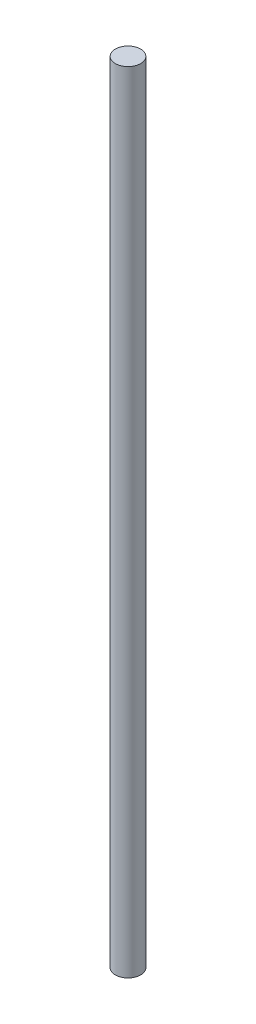
ISO-10303-21;
HEADER;
FILE_DESCRIPTION(('STEP AP214'),'2;1');
FILE_NAME('part.step','',(''),(''),'','','');
FILE_SCHEMA(('AUTOMOTIVE_DESIGN { 1 0 10303 214 1 1 1 1 }'));
ENDSEC;
DATA;
#1=APPLICATION_CONTEXT('core data for automotive mechanical design processes');
#2=APPLICATION_PROTOCOL_DEFINITION('international standard','automotive_design',2000,#1);
#3=PRODUCT_CONTEXT('',#1,'mechanical');
#4=PRODUCT('Part','Part','',(#3));
#5=PRODUCT_RELATED_PRODUCT_CATEGORY('part','',(#4));
#6=PRODUCT_DEFINITION_FORMATION('','',#4);
#7=PRODUCT_DEFINITION_CONTEXT('part definition',#1,'design');
#8=PRODUCT_DEFINITION('design','',#6,#7);
#9=PRODUCT_DEFINITION_SHAPE('','',#8);
#10=(LENGTH_UNIT() NAMED_UNIT(*) SI_UNIT(.MILLI.,.METRE.));
#11=(NAMED_UNIT(*) PLANE_ANGLE_UNIT() SI_UNIT($,.RADIAN.));
#12=(NAMED_UNIT(*) SI_UNIT($,.STERADIAN.) SOLID_ANGLE_UNIT());
#13=UNCERTAINTY_MEASURE_WITH_UNIT(LENGTH_MEASURE(1.E-05),#10,'distance_accuracy_value','');
#14=(GEOMETRIC_REPRESENTATION_CONTEXT(3) GLOBAL_UNCERTAINTY_ASSIGNED_CONTEXT((#13)) GLOBAL_UNIT_ASSIGNED_CONTEXT((#10,
#11,#12)) REPRESENTATION_CONTEXT('',''));
#15=CARTESIAN_POINT('',(0.,0.,0.));
#16=DIRECTION('',(0.,0.,1.));
#17=DIRECTION('',(1.,0.,0.));
#18=AXIS2_PLACEMENT_3D('',#15,#16,#17);
#19=CARTESIAN_POINT('',(-921.521254349404,1181.98868517442,-345.043069061507));
#20=DIRECTION('',(2.9817756882171E-09,-1.,-4.63428805747013E-09));
#21=DIRECTION('',(0.541091645075923,5.51068161935842E-09,-0.840963632762459));
#22=AXIS2_PLACEMENT_3D('',#19,#20,#21);
#23=CYLINDRICAL_SURFACE('',#22,16.);
#24=CARTESIAN_POINT('',(-921.521254349404,1181.98868517442,-345.043069061507));
#25=DIRECTION('',(-2.9817756882171E-09,1.,4.63428805747013E-09));
#26=DIRECTION('',(-0.541091645075923,-5.51068161935842E-09,0.840963632762459));
#27=AXIS2_PLACEMENT_3D('',#24,#25,#26);
#28=CIRCLE('',#27,16.);
#29=CARTESIAN_POINT('',(-930.178720670619,1181.98868508625,-331.587650937308));
#30=VERTEX_POINT('',#29);
#31=EDGE_CURVE('E10',#30,#30,#28,.T.);
#32=ORIENTED_EDGE('',*,*,#31,.F.);
#33=EDGE_LOOP('',(#32));
#34=FACE_BOUND('',#33,.T.);
#35=CARTESIAN_POINT('',(-921.521251367628,181.988685174421,-345.043073695795));
#36=DIRECTION('',(-2.9817756882171E-09,1.,4.63428805747013E-09));
#37=DIRECTION('',(-0.541091645075923,-5.51068161935842E-09,0.840963632762459));
#38=AXIS2_PLACEMENT_3D('',#35,#36,#37);
#39=CIRCLE('',#38,16.);
#40=CARTESIAN_POINT('',(-930.178717688843,181.98868508625,-331.587655571596));
#41=VERTEX_POINT('',#40);
#42=EDGE_CURVE('E32',#41,#41,#39,.T.);
#43=ORIENTED_EDGE('',*,*,#42,.T.);
#44=EDGE_LOOP('',(#43));
#45=FACE_BOUND('',#44,.T.);
#46=ADVANCED_FACE('F29',(#34,#45),#23,.T.);
#47=CARTESIAN_POINT('',(-921.521254349404,1181.98868517442,-345.043069061507));
#48=DIRECTION('',(-2.9817756882171E-09,1.,4.63428805747013E-09));
#49=DIRECTION('',(-0.541091645075923,-5.51068161935842E-09,0.840963632762459));
#50=AXIS2_PLACEMENT_3D('',#47,#48,#49);
#51=PLANE('',#50);
#52=ORIENTED_EDGE('',*,*,#31,.T.);
#53=EDGE_LOOP('',(#52));
#54=FACE_BOUND('',#53,.T.);
#55=ADVANCED_FACE('F44',(#54),#51,.T.);
#56=CARTESIAN_POINT('',(-921.521251367628,181.988685174421,-345.043073695795));
#57=DIRECTION('',(-2.9817756882171E-09,1.,4.63428805747013E-09));
#58=DIRECTION('',(-0.541091645075923,-5.51068161935842E-09,0.840963632762459));
#59=AXIS2_PLACEMENT_3D('',#56,#57,#58);
#60=PLANE('',#59);
#61=ORIENTED_EDGE('',*,*,#42,.F.);
#62=EDGE_LOOP('',(#61));
#63=FACE_BOUND('',#62,.T.);
#64=ADVANCED_FACE('F42',(#63),#60,.F.);
#65=CLOSED_SHELL('',(#46,#55,#64));
#66=MANIFOLD_SOLID_BREP('B2',#65);
#67=ADVANCED_BREP_SHAPE_REPRESENTATION('',(#18,#66),#14);
#68=SHAPE_DEFINITION_REPRESENTATION(#9,#67);
ENDSEC;
END-ISO-10303-21;
